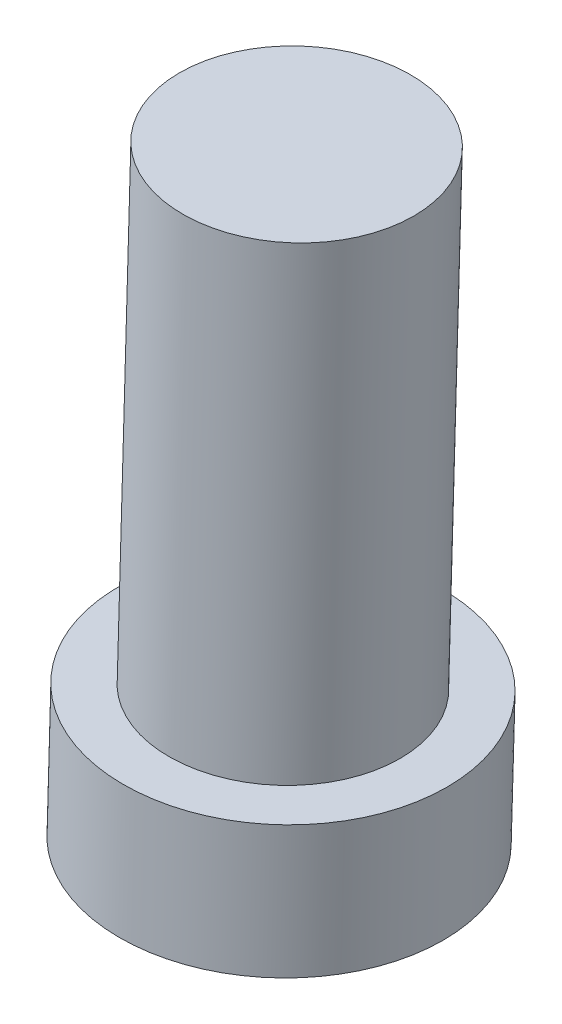
ISO-10303-21;
HEADER;
FILE_DESCRIPTION(('STEP AP214'),'2;1');
FILE_NAME('part.step','',(''),(''),'','','');
FILE_SCHEMA(('AUTOMOTIVE_DESIGN { 1 0 10303 214 1 1 1 1 }'));
ENDSEC;
DATA;
#1=APPLICATION_CONTEXT('core data for automotive mechanical design processes');
#2=APPLICATION_PROTOCOL_DEFINITION('international standard','automotive_design',2000,#1);
#3=PRODUCT_CONTEXT('',#1,'mechanical');
#4=PRODUCT('Part','Part','',(#3));
#5=PRODUCT_RELATED_PRODUCT_CATEGORY('part','',(#4));
#6=PRODUCT_DEFINITION_FORMATION('','',#4);
#7=PRODUCT_DEFINITION_CONTEXT('part definition',#1,'design');
#8=PRODUCT_DEFINITION('design','',#6,#7);
#9=PRODUCT_DEFINITION_SHAPE('','',#8);
#10=(LENGTH_UNIT() NAMED_UNIT(*) SI_UNIT(.MILLI.,.METRE.));
#11=(NAMED_UNIT(*) PLANE_ANGLE_UNIT() SI_UNIT($,.RADIAN.));
#12=(NAMED_UNIT(*) SI_UNIT($,.STERADIAN.) SOLID_ANGLE_UNIT());
#13=UNCERTAINTY_MEASURE_WITH_UNIT(LENGTH_MEASURE(1.E-05),#10,'distance_accuracy_value','');
#14=(GEOMETRIC_REPRESENTATION_CONTEXT(3) GLOBAL_UNCERTAINTY_ASSIGNED_CONTEXT((#13)) GLOBAL_UNIT_ASSIGNED_CONTEXT((#10,
#11,#12)) REPRESENTATION_CONTEXT('',''));
#15=CARTESIAN_POINT('',(0.,0.,0.));
#16=DIRECTION('',(0.,0.,1.));
#17=DIRECTION('',(1.,0.,0.));
#18=AXIS2_PLACEMENT_3D('',#15,#16,#17);
#19=CARTESIAN_POINT('',(-192.603180288174,45.0812248685981,-216.567475333));
#20=DIRECTION('',(-0.0287732149581036,-0.999585965338137,0.));
#21=DIRECTION('',(0.999585965338137,-0.0287732149581036,0.));
#22=AXIS2_PLACEMENT_3D('',#19,#20,#21);
#23=CYLINDRICAL_SURFACE('',#22,10.);
#24=CARTESIAN_POINT('',(-192.613797600954,44.7123777703412,-216.567475333));
#25=DIRECTION('',(-0.0287732149581036,-0.999585965338137,0.));
#26=DIRECTION('',(0.999585965338137,-0.0287732149581036,0.));
#27=AXIS2_PLACEMENT_3D('',#24,#25,#26);
#28=CIRCLE('',#27,10.);
#29=CARTESIAN_POINT('',(-182.617937947573,44.4246456207602,-216.567475333));
#30=VERTEX_POINT('',#29);
#31=EDGE_CURVE('E10',#30,#30,#28,.T.);
#32=ORIENTED_EDGE('',*,*,#31,.T.);
#33=EDGE_LOOP('',(#32));
#34=FACE_BOUND('',#33,.T.);
#35=CARTESIAN_POINT('',(-193.783578208999,4.07401740537624,-216.567475333));
#36=DIRECTION('',(-0.0287732149581036,-0.999585965338137,0.));
#37=DIRECTION('',(0.999585965338137,-0.0287732149581036,0.));
#38=AXIS2_PLACEMENT_3D('',#35,#36,#37);
#39=CIRCLE('',#38,9.99999999999999);
#40=CARTESIAN_POINT('',(-183.787718555617,3.7862852557952,-216.567475333));
#41=VERTEX_POINT('',#40);
#42=EDGE_CURVE('E48',#41,#41,#39,.T.);
#43=ORIENTED_EDGE('',*,*,#42,.F.);
#44=EDGE_LOOP('',(#43));
#45=FACE_BOUND('',#44,.T.);
#46=ADVANCED_FACE('F34',(#34,#45),#23,.T.);
#47=CARTESIAN_POINT('',(-182.617937947573,44.4246456207543,-216.567475333));
#48=DIRECTION('',(0.0287732149581036,0.999585965338137,0.));
#49=DIRECTION('',(-0.999585965338137,0.0287732149581036,0.));
#50=AXIS2_PLACEMENT_3D('',#47,#48,#49);
#51=PLANE('',#50);
#52=ORIENTED_EDGE('',*,*,#31,.F.);
#53=EDGE_LOOP('',(#52));
#54=FACE_BOUND('',#53,.T.);
#55=ADVANCED_FACE('F58',(#54),#51,.T.);
#56=CARTESIAN_POINT('',(-194.113827305044,-7.39888758467113,-216.567475333));
#57=DIRECTION('',(-0.0287732149581036,-0.999585965338137,0.));
#58=DIRECTION('',(0.999585965338137,-0.0287732149581036,0.));
#59=AXIS2_PLACEMENT_3D('',#56,#57,#58);
#60=PLANE('',#59);
#61=CARTESIAN_POINT('',(-194.113827305044,-7.39888758466221,-216.567475333));
#62=DIRECTION('',(-0.0287732149581036,-0.999585965338137,0.));
#63=DIRECTION('',(0.999585965338137,-0.0287732149581036,0.));
#64=AXIS2_PLACEMENT_3D('',#61,#62,#63);
#65=CIRCLE('',#64,14.);
#66=CARTESIAN_POINT('',(-180.11962379031,-7.80171259407566,-216.567475333));
#67=VERTEX_POINT('',#66);
#68=EDGE_CURVE('E40',#67,#67,#65,.T.);
#69=ORIENTED_EDGE('',*,*,#68,.T.);
#70=EDGE_LOOP('',(#69));
#71=FACE_BOUND('',#70,.T.);
#72=ADVANCED_FACE('F62',(#71),#60,.T.);
#73=CARTESIAN_POINT('',(-192.603180288174,45.0812248685981,-216.567475333));
#74=DIRECTION('',(-0.0287732149581036,-0.999585965338137,0.));
#75=DIRECTION('',(0.999585965338137,-0.0287732149581036,0.));
#76=AXIS2_PLACEMENT_3D('',#73,#74,#75);
#77=CYLINDRICAL_SURFACE('',#76,14.0000000000001);
#78=CARTESIAN_POINT('',(-193.783578208999,4.07401740536204,-216.567475333));
#79=DIRECTION('',(-0.0287732149581036,-0.999585965338137,0.));
#80=DIRECTION('',(0.999585965338137,-0.0287732149581036,0.));
#81=AXIS2_PLACEMENT_3D('',#78,#79,#80);
#82=CIRCLE('',#81,14.0000000000003);
#83=CARTESIAN_POINT('',(-179.789374694265,3.67119239594858,-216.567475333));
#84=VERTEX_POINT('',#83);
#85=EDGE_CURVE('E44',#84,#84,#82,.T.);
#86=ORIENTED_EDGE('',*,*,#85,.T.);
#87=EDGE_LOOP('',(#86));
#88=FACE_BOUND('',#87,.T.);
#89=ORIENTED_EDGE('',*,*,#68,.F.);
#90=EDGE_LOOP('',(#89));
#91=FACE_BOUND('',#90,.T.);
#92=ADVANCED_FACE('F67',(#88,#91),#77,.T.);
#93=CARTESIAN_POINT('',(-179.789374694265,3.67119239595568,-216.567475333));
#94=DIRECTION('',(0.0287732149581036,0.999585965338137,0.));
#95=DIRECTION('',(-0.999585965338137,0.0287732149581036,0.));
#96=AXIS2_PLACEMENT_3D('',#93,#94,#95);
#97=PLANE('',#96);
#98=ORIENTED_EDGE('',*,*,#42,.T.);
#99=EDGE_LOOP('',(#98));
#100=FACE_BOUND('',#99,.T.);
#101=ORIENTED_EDGE('',*,*,#85,.F.);
#102=EDGE_LOOP('',(#101));
#103=FACE_BOUND('',#102,.T.);
#104=ADVANCED_FACE('F54',(#100,#103),#97,.T.);
#105=CLOSED_SHELL('',(#46,#55,#72,#92,#104));
#106=MANIFOLD_SOLID_BREP('B2',#105);
#107=ADVANCED_BREP_SHAPE_REPRESENTATION('',(#18,#106),#14);
#108=SHAPE_DEFINITION_REPRESENTATION(#9,#107);
ENDSEC;
END-ISO-10303-21;
